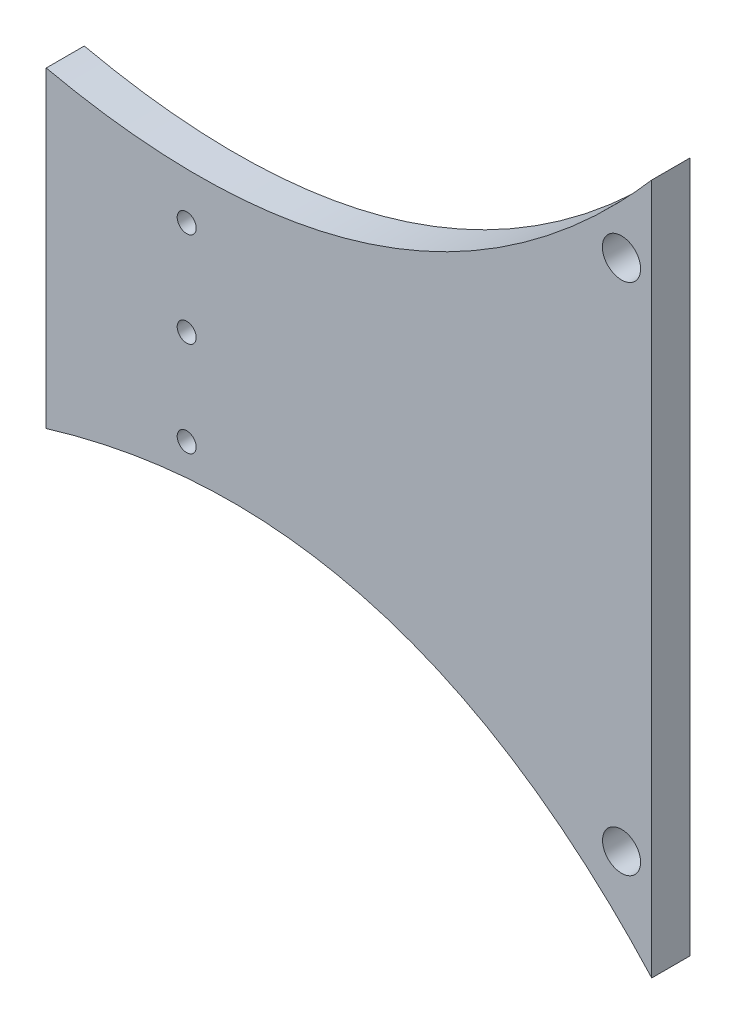
ISO-10303-21;
HEADER;
FILE_DESCRIPTION(('STEP AP214'),'2;1');
FILE_NAME('part.step','',(''),(''),'','','');
FILE_SCHEMA(('AUTOMOTIVE_DESIGN { 1 0 10303 214 1 1 1 1 }'));
ENDSEC;
DATA;
#1=APPLICATION_CONTEXT('core data for automotive mechanical design processes');
#2=APPLICATION_PROTOCOL_DEFINITION('international standard','automotive_design',2000,#1);
#3=PRODUCT_CONTEXT('',#1,'mechanical');
#4=PRODUCT('Part','Part','',(#3));
#5=PRODUCT_RELATED_PRODUCT_CATEGORY('part','',(#4));
#6=PRODUCT_DEFINITION_FORMATION('','',#4);
#7=PRODUCT_DEFINITION_CONTEXT('part definition',#1,'design');
#8=PRODUCT_DEFINITION('design','',#6,#7);
#9=PRODUCT_DEFINITION_SHAPE('','',#8);
#10=(LENGTH_UNIT() NAMED_UNIT(*) SI_UNIT(.MILLI.,.METRE.));
#11=(NAMED_UNIT(*) PLANE_ANGLE_UNIT() SI_UNIT($,.RADIAN.));
#12=(NAMED_UNIT(*) SI_UNIT($,.STERADIAN.) SOLID_ANGLE_UNIT());
#13=UNCERTAINTY_MEASURE_WITH_UNIT(LENGTH_MEASURE(1.E-05),#10,'distance_accuracy_value','');
#14=(GEOMETRIC_REPRESENTATION_CONTEXT(3) GLOBAL_UNCERTAINTY_ASSIGNED_CONTEXT((#13)) GLOBAL_UNIT_ASSIGNED_CONTEXT((#10,
#11,#12)) REPRESENTATION_CONTEXT('',''));
#15=CARTESIAN_POINT('',(0.,0.,0.));
#16=DIRECTION('',(0.,0.,1.));
#17=DIRECTION('',(1.,0.,0.));
#18=AXIS2_PLACEMENT_3D('',#15,#16,#17);
#19=CARTESIAN_POINT('',(0.,0.,2.));
#20=DIRECTION('',(-1.,0.,0.));
#21=DIRECTION('',(0.,0.,1.));
#22=AXIS2_PLACEMENT_3D('',#19,#20,#21);
#23=PLANE('',#22);
#24=DIRECTION('',(0.,1.,0.));
#25=VECTOR('',#24,1.);
#26=CARTESIAN_POINT('',(0.,0.,0.));
#27=LINE('',#26,#25);
#28=CARTESIAN_POINT('',(0.,6.796629536,0.));
#29=VERTEX_POINT('',#28);
#30=CARTESIAN_POINT('',(0.,23.2033703823716,0.));
#31=VERTEX_POINT('',#30);
#32=EDGE_CURVE('E158',#29,#31,#27,.T.);
#33=ORIENTED_EDGE('',*,*,#32,.F.);
#34=DIRECTION('',(0.,0.,-1.));
#35=VECTOR('',#34,1.);
#36=CARTESIAN_POINT('',(0.,6.796629536,2.));
#37=LINE('',#36,#35);
#38=CARTESIAN_POINT('',(0.,6.796629536,2.));
#39=VERTEX_POINT('',#38);
#40=EDGE_CURVE('E11',#39,#29,#37,.T.);
#41=ORIENTED_EDGE('',*,*,#40,.F.);
#42=DIRECTION('',(0.,1.,0.));
#43=VECTOR('',#42,1.);
#44=CARTESIAN_POINT('',(0.,0.,2.));
#45=LINE('',#44,#43);
#46=CARTESIAN_POINT('',(0.,23.2033703823716,2.));
#47=VERTEX_POINT('',#46);
#48=EDGE_CURVE('E82',#39,#47,#45,.T.);
#49=ORIENTED_EDGE('',*,*,#48,.T.);
#50=DIRECTION('',(0.,0.,-1.));
#51=VECTOR('',#50,1.);
#52=CARTESIAN_POINT('',(0.,23.2033703823716,2.));
#53=LINE('',#52,#51);
#54=EDGE_CURVE('E50',#47,#31,#53,.T.);
#55=ORIENTED_EDGE('',*,*,#54,.T.);
#56=EDGE_LOOP('',(#33,#41,#49,#55));
#57=FACE_BOUND('',#56,.T.);
#58=ADVANCED_FACE('F33',(#57),#23,.T.);
#59=CARTESIAN_POINT('',(0.,6.796629536,2.));
#60=CARTESIAN_POINT('',(18.4732186096735,12.3969526778576,2.));
#61=CARTESIAN_POINT('',(31.8162913469529,-2.29708515510652,2.));
#62=B_SPLINE_CURVE_WITH_KNOTS('',2,(#59,#60,#61),.UNSPECIFIED.,.F.,.F.,(3,3),(0.,1.),.UNSPECIFIED.);
#63=DIRECTION('',(0.,0.,-1.));
#64=VECTOR('',#63,1.);
#65=SURFACE_OF_LINEAR_EXTRUSION('',#62,#64);
#66=CARTESIAN_POINT('',(0.,6.796629536,0.));
#67=CARTESIAN_POINT('',(18.4732186096735,12.3969526778576,0.));
#68=CARTESIAN_POINT('',(31.8162913469529,-2.29708515510652,0.));
#69=B_SPLINE_CURVE_WITH_KNOTS('',2,(#66,#67,#68),.UNSPECIFIED.,.F.,.F.,(3,3),(0.,1.),.UNSPECIFIED.);
#70=CARTESIAN_POINT('',(31.8162913469529,-2.29708515510652,0.));
#71=VERTEX_POINT('',#70);
#72=EDGE_CURVE('E88',#29,#71,#69,.T.);
#73=ORIENTED_EDGE('',*,*,#72,.T.);
#74=DIRECTION('',(0.,0.,-1.));
#75=VECTOR('',#74,1.);
#76=CARTESIAN_POINT('',(31.8162913469529,-2.29708515510652,2.));
#77=LINE('',#76,#75);
#78=CARTESIAN_POINT('',(31.8162913469529,-2.29708515510652,2.));
#79=VERTEX_POINT('',#78);
#80=EDGE_CURVE('E42',#79,#71,#77,.T.);
#81=ORIENTED_EDGE('',*,*,#80,.F.);
#82=EDGE_CURVE('E76',#39,#79,#62,.T.);
#83=ORIENTED_EDGE('',*,*,#82,.F.);
#84=ORIENTED_EDGE('',*,*,#40,.T.);
#85=EDGE_LOOP('',(#73,#81,#83,#84));
#86=FACE_BOUND('',#85,.T.);
#87=ADVANCED_FACE('F86',(#86),#65,.F.);
#88=CARTESIAN_POINT('',(31.8162913469529,0.,2.));
#89=DIRECTION('',(1.,0.,0.));
#90=DIRECTION('',(0.,1.,0.));
#91=AXIS2_PLACEMENT_3D('',#88,#89,#90);
#92=PLANE('',#91);
#93=DIRECTION('',(0.,-1.,0.));
#94=VECTOR('',#93,1.);
#95=CARTESIAN_POINT('',(31.8162913469529,0.,0.));
#96=LINE('',#95,#94);
#97=CARTESIAN_POINT('',(31.8162913469528,34.0137260184434,0.));
#98=VERTEX_POINT('',#97);
#99=EDGE_CURVE('E163',#98,#71,#96,.T.);
#100=ORIENTED_EDGE('',*,*,#99,.F.);
#101=DIRECTION('',(0.,0.,-1.));
#102=VECTOR('',#101,1.);
#103=CARTESIAN_POINT('',(31.8162913469528,34.0137260184434,2.));
#104=LINE('',#103,#102);
#105=CARTESIAN_POINT('',(31.8162913469528,34.0137260184434,2.));
#106=VERTEX_POINT('',#105);
#107=EDGE_CURVE('E63',#106,#98,#104,.T.);
#108=ORIENTED_EDGE('',*,*,#107,.F.);
#109=DIRECTION('',(0.,-1.,0.));
#110=VECTOR('',#109,1.);
#111=CARTESIAN_POINT('',(31.8162913469529,0.,2.));
#112=LINE('',#111,#110);
#113=EDGE_CURVE('E81',#106,#79,#112,.T.);
#114=ORIENTED_EDGE('',*,*,#113,.T.);
#115=ORIENTED_EDGE('',*,*,#80,.T.);
#116=EDGE_LOOP('',(#100,#108,#114,#115));
#117=FACE_BOUND('',#116,.T.);
#118=ADVANCED_FACE('F91',(#117),#92,.T.);
#119=CARTESIAN_POINT('',(30.2303340091267,2.6758371658957,2.));
#120=DIRECTION('',(0.,0.,-1.));
#121=DIRECTION('',(-1.,0.,0.));
#122=AXIS2_PLACEMENT_3D('',#119,#120,#121);
#123=CYLINDRICAL_SURFACE('',#122,1.);
#124=CARTESIAN_POINT('',(30.2303340091267,2.6758371658957,2.));
#125=DIRECTION('',(0.,0.,1.));
#126=DIRECTION('',(1.,0.,0.));
#127=AXIS2_PLACEMENT_3D('',#124,#125,#126);
#128=CIRCLE('',#127,1.);
#129=CARTESIAN_POINT('',(31.2303340091267,2.6758371658957,2.));
#130=VERTEX_POINT('',#129);
#131=EDGE_CURVE('E190',#130,#130,#128,.T.);
#132=ORIENTED_EDGE('',*,*,#131,.T.);
#133=EDGE_LOOP('',(#132));
#134=FACE_BOUND('',#133,.T.);
#135=CARTESIAN_POINT('',(30.2303340091267,2.6758371658957,0.));
#136=DIRECTION('',(0.,0.,1.));
#137=DIRECTION('',(1.,0.,0.));
#138=AXIS2_PLACEMENT_3D('',#135,#136,#137);
#139=CIRCLE('',#138,1.);
#140=CARTESIAN_POINT('',(31.2303340091267,2.6758371658957,0.));
#141=VERTEX_POINT('',#140);
#142=EDGE_CURVE('E155',#141,#141,#139,.T.);
#143=ORIENTED_EDGE('',*,*,#142,.F.);
#144=EDGE_LOOP('',(#143));
#145=FACE_BOUND('',#144,.T.);
#146=ADVANCED_FACE('F117',(#134,#145),#123,.F.);
#147=CARTESIAN_POINT('',(30.2270510816469,29.6758369663103,2.));
#148=DIRECTION('',(0.,0.,-1.));
#149=DIRECTION('',(-1.,0.,0.));
#150=AXIS2_PLACEMENT_3D('',#147,#148,#149);
#151=CYLINDRICAL_SURFACE('',#150,1.00458471386332);
#152=CARTESIAN_POINT('',(30.2270510816469,29.6758369663103,2.));
#153=DIRECTION('',(0.,0.,1.));
#154=DIRECTION('',(1.,0.,0.));
#155=AXIS2_PLACEMENT_3D('',#152,#153,#154);
#156=CIRCLE('',#155,1.00458471386332);
#157=CARTESIAN_POINT('',(31.2316357955103,29.6758369663103,2.));
#158=VERTEX_POINT('',#157);
#159=EDGE_CURVE('E187',#158,#158,#156,.T.);
#160=ORIENTED_EDGE('',*,*,#159,.T.);
#161=EDGE_LOOP('',(#160));
#162=FACE_BOUND('',#161,.T.);
#163=CARTESIAN_POINT('',(30.2270510816469,29.6758369663103,0.));
#164=DIRECTION('',(0.,0.,1.));
#165=DIRECTION('',(1.,0.,0.));
#166=AXIS2_PLACEMENT_3D('',#163,#164,#165);
#167=CIRCLE('',#166,1.00458471386332);
#168=CARTESIAN_POINT('',(31.2316357955103,29.6758369663103,0.));
#169=VERTEX_POINT('',#168);
#170=EDGE_CURVE('E149',#169,#169,#167,.T.);
#171=ORIENTED_EDGE('',*,*,#170,.F.);
#172=EDGE_LOOP('',(#171));
#173=FACE_BOUND('',#172,.T.);
#174=ADVANCED_FACE('F124',(#162,#173),#151,.F.);
#175=CARTESIAN_POINT('',(7.38214785285637,19.8534481908882,2.));
#176=DIRECTION('',(0.,0.,-1.));
#177=DIRECTION('',(-1.,0.,0.));
#178=AXIS2_PLACEMENT_3D('',#175,#176,#177);
#179=CYLINDRICAL_SURFACE('',#178,0.500000000000003);
#180=CARTESIAN_POINT('',(7.38214785285637,19.8534481908882,2.));
#181=DIRECTION('',(0.,0.,1.));
#182=DIRECTION('',(1.,0.,0.));
#183=AXIS2_PLACEMENT_3D('',#180,#181,#182);
#184=CIRCLE('',#183,0.500000000000003);
#185=CARTESIAN_POINT('',(7.88214785285637,19.8534481908882,2.));
#186=VERTEX_POINT('',#185);
#187=EDGE_CURVE('E182',#186,#186,#184,.T.);
#188=ORIENTED_EDGE('',*,*,#187,.T.);
#189=EDGE_LOOP('',(#188));
#190=FACE_BOUND('',#189,.T.);
#191=CARTESIAN_POINT('',(7.38214785285637,19.8534481908882,0.));
#192=DIRECTION('',(0.,0.,1.));
#193=DIRECTION('',(1.,0.,0.));
#194=AXIS2_PLACEMENT_3D('',#191,#192,#193);
#195=CIRCLE('',#194,0.500000000000003);
#196=CARTESIAN_POINT('',(7.88214785285637,19.8534481908882,0.));
#197=VERTEX_POINT('',#196);
#198=EDGE_CURVE('E147',#197,#197,#195,.T.);
#199=ORIENTED_EDGE('',*,*,#198,.F.);
#200=EDGE_LOOP('',(#199));
#201=FACE_BOUND('',#200,.T.);
#202=ADVANCED_FACE('F128',(#190,#201),#179,.F.);
#203=CARTESIAN_POINT('',(7.38214785285638,9.8896068028882,2.));
#204=DIRECTION('',(0.,0.,-1.));
#205=DIRECTION('',(-1.,0.,0.));
#206=AXIS2_PLACEMENT_3D('',#203,#204,#205);
#207=CYLINDRICAL_SURFACE('',#206,0.500000000000003);
#208=CARTESIAN_POINT('',(7.38214785285638,9.8896068028882,2.));
#209=DIRECTION('',(0.,0.,1.));
#210=DIRECTION('',(1.,0.,0.));
#211=AXIS2_PLACEMENT_3D('',#208,#209,#210);
#212=CIRCLE('',#211,0.500000000000003);
#213=CARTESIAN_POINT('',(7.88214785285638,9.8896068028882,2.));
#214=VERTEX_POINT('',#213);
#215=EDGE_CURVE('E142',#214,#214,#212,.T.);
#216=ORIENTED_EDGE('',*,*,#215,.T.);
#217=EDGE_LOOP('',(#216));
#218=FACE_BOUND('',#217,.T.);
#219=CARTESIAN_POINT('',(7.38214785285638,9.8896068028882,0.));
#220=DIRECTION('',(0.,0.,1.));
#221=DIRECTION('',(1.,0.,0.));
#222=AXIS2_PLACEMENT_3D('',#219,#220,#221);
#223=CIRCLE('',#222,0.500000000000003);
#224=CARTESIAN_POINT('',(7.88214785285638,9.8896068028882,0.));
#225=VERTEX_POINT('',#224);
#226=EDGE_CURVE('E145',#225,#225,#223,.T.);
#227=ORIENTED_EDGE('',*,*,#226,.F.);
#228=EDGE_LOOP('',(#227));
#229=FACE_BOUND('',#228,.T.);
#230=ADVANCED_FACE('F131',(#218,#229),#207,.F.);
#231=CARTESIAN_POINT('',(7.38214785285637,14.8715274968882,2.));
#232=DIRECTION('',(0.,0.,-1.));
#233=DIRECTION('',(-1.,0.,0.));
#234=AXIS2_PLACEMENT_3D('',#231,#232,#233);
#235=CYLINDRICAL_SURFACE('',#234,0.500000000000001);
#236=CARTESIAN_POINT('',(7.38214785285637,14.8715274968882,2.));
#237=DIRECTION('',(0.,0.,1.));
#238=DIRECTION('',(1.,0.,0.));
#239=AXIS2_PLACEMENT_3D('',#236,#237,#238);
#240=CIRCLE('',#239,0.500000000000001);
#241=CARTESIAN_POINT('',(7.88214785285637,14.8715274968882,2.));
#242=VERTEX_POINT('',#241);
#243=EDGE_CURVE('E173',#242,#242,#240,.T.);
#244=ORIENTED_EDGE('',*,*,#243,.T.);
#245=EDGE_LOOP('',(#244));
#246=FACE_BOUND('',#245,.T.);
#247=CARTESIAN_POINT('',(7.38214785285637,14.8715274968882,0.));
#248=DIRECTION('',(0.,0.,1.));
#249=DIRECTION('',(1.,0.,0.));
#250=AXIS2_PLACEMENT_3D('',#247,#248,#249);
#251=CIRCLE('',#250,0.500000000000001);
#252=CARTESIAN_POINT('',(7.88214785285637,14.8715274968882,0.));
#253=VERTEX_POINT('',#252);
#254=EDGE_CURVE('E103',#253,#253,#251,.T.);
#255=ORIENTED_EDGE('',*,*,#254,.F.);
#256=EDGE_LOOP('',(#255));
#257=FACE_BOUND('',#256,.T.);
#258=ADVANCED_FACE('F35',(#246,#257),#235,.F.);
#259=CARTESIAN_POINT('',(0.,23.2033703823716,2.));
#260=CARTESIAN_POINT('',(18.8241088245987,19.0228760468048,2.));
#261=CARTESIAN_POINT('',(31.8162913469528,34.0137260184434,2.));
#262=B_SPLINE_CURVE_WITH_KNOTS('',2,(#259,#260,#261),.UNSPECIFIED.,.F.,.F.,(3,3),(0.,1.),.UNSPECIFIED.);
#263=DIRECTION('',(0.,0.,-1.));
#264=VECTOR('',#263,1.);
#265=SURFACE_OF_LINEAR_EXTRUSION('',#262,#264);
#266=CARTESIAN_POINT('',(0.,23.2033703823716,0.));
#267=CARTESIAN_POINT('',(18.8241088245987,19.0228760468048,0.));
#268=CARTESIAN_POINT('',(31.8162913469528,34.0137260184434,0.));
#269=B_SPLINE_CURVE_WITH_KNOTS('',2,(#266,#267,#268),.UNSPECIFIED.,.F.,.F.,(3,3),(0.,1.),.UNSPECIFIED.);
#270=EDGE_CURVE('E168',#31,#98,#269,.T.);
#271=ORIENTED_EDGE('',*,*,#270,.F.);
#272=ORIENTED_EDGE('',*,*,#54,.F.);
#273=EDGE_CURVE('E92',#47,#106,#262,.T.);
#274=ORIENTED_EDGE('',*,*,#273,.T.);
#275=ORIENTED_EDGE('',*,*,#107,.T.);
#276=EDGE_LOOP('',(#271,#272,#274,#275));
#277=FACE_BOUND('',#276,.T.);
#278=ADVANCED_FACE('F109',(#277),#265,.T.);
#279=CARTESIAN_POINT('',(0.,0.,2.));
#280=DIRECTION('',(0.,0.,1.));
#281=DIRECTION('',(1.,0.,0.));
#282=AXIS2_PLACEMENT_3D('',#279,#280,#281);
#283=PLANE('',#282);
#284=ORIENTED_EDGE('',*,*,#243,.F.);
#285=EDGE_LOOP('',(#284));
#286=FACE_BOUND('',#285,.T.);
#287=ORIENTED_EDGE('',*,*,#215,.F.);
#288=EDGE_LOOP('',(#287));
#289=FACE_BOUND('',#288,.T.);
#290=ORIENTED_EDGE('',*,*,#187,.F.);
#291=EDGE_LOOP('',(#290));
#292=FACE_BOUND('',#291,.T.);
#293=ORIENTED_EDGE('',*,*,#159,.F.);
#294=EDGE_LOOP('',(#293));
#295=FACE_BOUND('',#294,.T.);
#296=ORIENTED_EDGE('',*,*,#131,.F.);
#297=EDGE_LOOP('',(#296));
#298=FACE_BOUND('',#297,.T.);
#299=ORIENTED_EDGE('',*,*,#48,.F.);
#300=ORIENTED_EDGE('',*,*,#82,.T.);
#301=ORIENTED_EDGE('',*,*,#113,.F.);
#302=ORIENTED_EDGE('',*,*,#273,.F.);
#303=EDGE_LOOP('',(#299,#300,#301,#302));
#304=FACE_BOUND('',#303,.T.);
#305=ADVANCED_FACE('F78',(#286,#289,#292,#295,#298,#304),#283,.T.);
#306=CARTESIAN_POINT('',(0.,0.,0.));
#307=DIRECTION('',(0.,0.,1.));
#308=DIRECTION('',(1.,0.,0.));
#309=AXIS2_PLACEMENT_3D('',#306,#307,#308);
#310=PLANE('',#309);
#311=ORIENTED_EDGE('',*,*,#254,.T.);
#312=EDGE_LOOP('',(#311));
#313=FACE_BOUND('',#312,.T.);
#314=ORIENTED_EDGE('',*,*,#226,.T.);
#315=EDGE_LOOP('',(#314));
#316=FACE_BOUND('',#315,.T.);
#317=ORIENTED_EDGE('',*,*,#198,.T.);
#318=EDGE_LOOP('',(#317));
#319=FACE_BOUND('',#318,.T.);
#320=ORIENTED_EDGE('',*,*,#170,.T.);
#321=EDGE_LOOP('',(#320));
#322=FACE_BOUND('',#321,.T.);
#323=ORIENTED_EDGE('',*,*,#142,.T.);
#324=EDGE_LOOP('',(#323));
#325=FACE_BOUND('',#324,.T.);
#326=ORIENTED_EDGE('',*,*,#32,.T.);
#327=ORIENTED_EDGE('',*,*,#270,.T.);
#328=ORIENTED_EDGE('',*,*,#99,.T.);
#329=ORIENTED_EDGE('',*,*,#72,.F.);
#330=EDGE_LOOP('',(#326,#327,#328,#329));
#331=FACE_BOUND('',#330,.T.);
#332=ADVANCED_FACE('F113',(#313,#316,#319,#322,#325,#331),#310,.F.);
#333=CLOSED_SHELL('',(#58,#87,#118,#146,#174,#202,#230,#258,#278,#305,#332));
#334=MANIFOLD_SOLID_BREP('B2',#333);
#335=ADVANCED_BREP_SHAPE_REPRESENTATION('',(#18,#334),#14);
#336=SHAPE_DEFINITION_REPRESENTATION(#9,#335);
ENDSEC;
END-ISO-10303-21;
